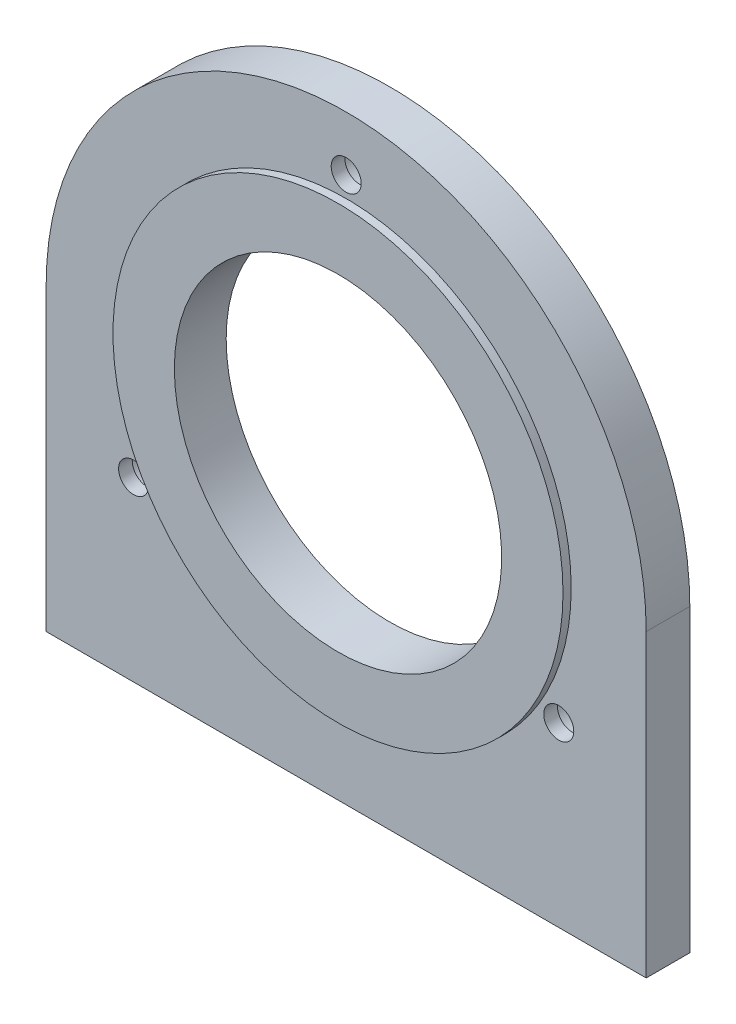
ISO-10303-21;
HEADER;
FILE_DESCRIPTION(('STEP AP214'),'2;1');
FILE_NAME('part.step','',(''),(''),'','','');
FILE_SCHEMA(('AUTOMOTIVE_DESIGN { 1 0 10303 214 1 1 1 1 }'));
ENDSEC;
DATA;
#1=APPLICATION_CONTEXT('core data for automotive mechanical design processes');
#2=APPLICATION_PROTOCOL_DEFINITION('international standard','automotive_design',2000,#1);
#3=PRODUCT_CONTEXT('',#1,'mechanical');
#4=PRODUCT('Part','Part','',(#3));
#5=PRODUCT_RELATED_PRODUCT_CATEGORY('part','',(#4));
#6=PRODUCT_DEFINITION_FORMATION('','',#4);
#7=PRODUCT_DEFINITION_CONTEXT('part definition',#1,'design');
#8=PRODUCT_DEFINITION('design','',#6,#7);
#9=PRODUCT_DEFINITION_SHAPE('','',#8);
#10=(LENGTH_UNIT() NAMED_UNIT(*) SI_UNIT(.MILLI.,.METRE.));
#11=(NAMED_UNIT(*) PLANE_ANGLE_UNIT() SI_UNIT($,.RADIAN.));
#12=(NAMED_UNIT(*) SI_UNIT($,.STERADIAN.) SOLID_ANGLE_UNIT());
#13=UNCERTAINTY_MEASURE_WITH_UNIT(LENGTH_MEASURE(1.E-05),#10,'distance_accuracy_value','');
#14=(GEOMETRIC_REPRESENTATION_CONTEXT(3) GLOBAL_UNCERTAINTY_ASSIGNED_CONTEXT((#13)) GLOBAL_UNIT_ASSIGNED_CONTEXT((#10,
#11,#12)) REPRESENTATION_CONTEXT('',''));
#15=CARTESIAN_POINT('',(0.,0.,0.));
#16=DIRECTION('',(0.,0.,1.));
#17=DIRECTION('',(1.,0.,0.));
#18=AXIS2_PLACEMENT_3D('',#15,#16,#17);
#19=CARTESIAN_POINT('',(0.,0.,16.));
#20=DIRECTION('',(0.,0.,1.));
#21=DIRECTION('',(1.,0.,0.));
#22=AXIS2_PLACEMENT_3D('',#19,#20,#21);
#23=PLANE('',#22);
#24=CARTESIAN_POINT('',(-77.9422863405999,-44.9999999999993,16.));
#25=DIRECTION('',(0.,0.,1.));
#26=DIRECTION('',(1.,0.,0.));
#27=AXIS2_PLACEMENT_3D('',#24,#25,#26);
#28=CIRCLE('',#27,5.49999999999999);
#29=CARTESIAN_POINT('',(-72.4422863405999,-44.9999999999993,16.));
#30=VERTEX_POINT('',#29);
#31=EDGE_CURVE('E41',#30,#30,#28,.T.);
#32=ORIENTED_EDGE('',*,*,#31,.F.);
#33=EDGE_LOOP('',(#32));
#34=FACE_BOUND('',#33,.T.);
#35=CARTESIAN_POINT('',(77.9422863405993,-45.0000000000004,16.));
#36=DIRECTION('',(0.,0.,1.));
#37=DIRECTION('',(1.,0.,0.));
#38=AXIS2_PLACEMENT_3D('',#35,#36,#37);
#39=CIRCLE('',#38,5.49999999999999);
#40=CARTESIAN_POINT('',(83.4422863405993,-45.0000000000004,16.));
#41=VERTEX_POINT('',#40);
#42=EDGE_CURVE('E118',#41,#41,#39,.T.);
#43=ORIENTED_EDGE('',*,*,#42,.F.);
#44=EDGE_LOOP('',(#43));
#45=FACE_BOUND('',#44,.T.);
#46=CARTESIAN_POINT('',(0.,90.,16.));
#47=DIRECTION('',(0.,0.,1.));
#48=DIRECTION('',(1.,0.,0.));
#49=AXIS2_PLACEMENT_3D('',#46,#47,#48);
#50=CIRCLE('',#49,5.5);
#51=CARTESIAN_POINT('',(5.5,90.,16.));
#52=VERTEX_POINT('',#51);
#53=EDGE_CURVE('E115',#52,#52,#50,.T.);
#54=ORIENTED_EDGE('',*,*,#53,.F.);
#55=EDGE_LOOP('',(#54));
#56=FACE_BOUND('',#55,.T.);
#57=CARTESIAN_POINT('',(0.,0.,16.));
#58=DIRECTION('',(0.,0.,1.));
#59=DIRECTION('',(1.,0.,0.));
#60=AXIS2_PLACEMENT_3D('',#57,#58,#59);
#61=CIRCLE('',#60,110.);
#62=CARTESIAN_POINT('',(110.,0.,16.));
#63=VERTEX_POINT('',#62);
#64=CARTESIAN_POINT('',(-110.,0.,16.));
#65=VERTEX_POINT('',#64);
#66=EDGE_CURVE('E11',#63,#65,#61,.T.);
#67=ORIENTED_EDGE('',*,*,#66,.T.);
#68=DIRECTION('',(0.,-1.,0.));
#69=VECTOR('',#68,1.);
#70=CARTESIAN_POINT('',(-110.,0.,16.));
#71=LINE('',#70,#69);
#72=CARTESIAN_POINT('',(-110.,-110.,16.));
#73=VERTEX_POINT('',#72);
#74=EDGE_CURVE('E82',#65,#73,#71,.T.);
#75=ORIENTED_EDGE('',*,*,#74,.T.);
#76=DIRECTION('',(1.,0.,0.));
#77=VECTOR('',#76,1.);
#78=CARTESIAN_POINT('',(-110.,-110.,16.));
#79=LINE('',#78,#77);
#80=CARTESIAN_POINT('',(110.,-110.,16.));
#81=VERTEX_POINT('',#80);
#82=EDGE_CURVE('E90',#73,#81,#79,.T.);
#83=ORIENTED_EDGE('',*,*,#82,.T.);
#84=DIRECTION('',(0.,1.,0.));
#85=VECTOR('',#84,1.);
#86=CARTESIAN_POINT('',(110.,0.,16.));
#87=LINE('',#86,#85);
#88=EDGE_CURVE('E87',#81,#63,#87,.T.);
#89=ORIENTED_EDGE('',*,*,#88,.T.);
#90=EDGE_LOOP('',(#67,#75,#83,#89));
#91=FACE_BOUND('',#90,.T.);
#92=CARTESIAN_POINT('',(0.,0.,16.));
#93=DIRECTION('',(0.,0.,1.));
#94=DIRECTION('',(1.,0.,0.));
#95=AXIS2_PLACEMENT_3D('',#92,#93,#94);
#96=CIRCLE('',#95,82.5);
#97=CARTESIAN_POINT('',(82.5,0.,16.));
#98=VERTEX_POINT('',#97);
#99=EDGE_CURVE('E101',#98,#98,#96,.T.);
#100=ORIENTED_EDGE('',*,*,#99,.F.);
#101=EDGE_LOOP('',(#100));
#102=FACE_BOUND('',#101,.T.);
#103=ADVANCED_FACE('F37',(#34,#45,#56,#91,#102),#23,.T.);
#104=CARTESIAN_POINT('',(0.,0.,16.));
#105=DIRECTION('',(0.,0.,-1.));
#106=DIRECTION('',(-1.,0.,0.));
#107=AXIS2_PLACEMENT_3D('',#104,#105,#106);
#108=CYLINDRICAL_SURFACE('',#107,110.);
#109=CARTESIAN_POINT('',(0.,0.,0.));
#110=DIRECTION('',(0.,0.,1.));
#111=DIRECTION('',(1.,0.,0.));
#112=AXIS2_PLACEMENT_3D('',#109,#110,#111);
#113=CIRCLE('',#112,110.);
#114=CARTESIAN_POINT('',(110.,0.,0.));
#115=VERTEX_POINT('',#114);
#116=CARTESIAN_POINT('',(-110.,0.,0.));
#117=VERTEX_POINT('',#116);
#118=EDGE_CURVE('E46',#115,#117,#113,.T.);
#119=ORIENTED_EDGE('',*,*,#118,.T.);
#120=DIRECTION('',(0.,0.,1.));
#121=VECTOR('',#120,1.);
#122=CARTESIAN_POINT('',(-110.,0.,-245.967477524977));
#123=LINE('',#122,#121);
#124=EDGE_CURVE('E54',#117,#65,#123,.T.);
#125=ORIENTED_EDGE('',*,*,#124,.T.);
#126=ORIENTED_EDGE('',*,*,#66,.F.);
#127=DIRECTION('',(0.,0.,1.));
#128=VECTOR('',#127,1.);
#129=CARTESIAN_POINT('',(110.,0.,-245.967477524977));
#130=LINE('',#129,#128);
#131=EDGE_CURVE('E109',#115,#63,#130,.T.);
#132=ORIENTED_EDGE('',*,*,#131,.F.);
#133=EDGE_LOOP('',(#119,#125,#126,#132));
#134=FACE_BOUND('',#133,.T.);
#135=ADVANCED_FACE('F39',(#134),#108,.T.);
#136=CARTESIAN_POINT('',(0.,0.,0.));
#137=DIRECTION('',(0.,0.,1.));
#138=DIRECTION('',(1.,0.,0.));
#139=AXIS2_PLACEMENT_3D('',#136,#137,#138);
#140=PLANE('',#139);
#141=CARTESIAN_POINT('',(0.,0.,0.));
#142=DIRECTION('',(0.,0.,-1.));
#143=DIRECTION('',(-1.,0.,0.));
#144=AXIS2_PLACEMENT_3D('',#141,#142,#143);
#145=CIRCLE('',#144,60.);
#146=CARTESIAN_POINT('',(-60.,0.,0.));
#147=VERTEX_POINT('',#146);
#148=EDGE_CURVE('E176',#147,#147,#145,.T.);
#149=ORIENTED_EDGE('',*,*,#148,.F.);
#150=EDGE_LOOP('',(#149));
#151=FACE_BOUND('',#150,.T.);
#152=CARTESIAN_POINT('',(-77.9422863405999,-44.9999999999993,0.));
#153=DIRECTION('',(0.,0.,-1.));
#154=DIRECTION('',(-1.,0.,0.));
#155=AXIS2_PLACEMENT_3D('',#152,#153,#154);
#156=CIRCLE('',#155,8.99999999999999);
#157=CARTESIAN_POINT('',(-86.9422863405999,-44.9999999999993,0.));
#158=VERTEX_POINT('',#157);
#159=EDGE_CURVE('E180',#158,#158,#156,.T.);
#160=ORIENTED_EDGE('',*,*,#159,.F.);
#161=EDGE_LOOP('',(#160));
#162=FACE_BOUND('',#161,.T.);
#163=CARTESIAN_POINT('',(77.9422863405993,-45.0000000000004,0.));
#164=DIRECTION('',(0.,0.,-1.));
#165=DIRECTION('',(-1.,0.,0.));
#166=AXIS2_PLACEMENT_3D('',#163,#164,#165);
#167=CIRCLE('',#166,8.99999999999999);
#168=CARTESIAN_POINT('',(68.9422863405993,-45.0000000000004,0.));
#169=VERTEX_POINT('',#168);
#170=EDGE_CURVE('E133',#169,#169,#167,.T.);
#171=ORIENTED_EDGE('',*,*,#170,.F.);
#172=EDGE_LOOP('',(#171));
#173=FACE_BOUND('',#172,.T.);
#174=CARTESIAN_POINT('',(0.,90.,0.));
#175=DIRECTION('',(0.,0.,-1.));
#176=DIRECTION('',(-1.,0.,0.));
#177=AXIS2_PLACEMENT_3D('',#174,#175,#176);
#178=CIRCLE('',#177,9.);
#179=CARTESIAN_POINT('',(-9.,90.,0.));
#180=VERTEX_POINT('',#179);
#181=EDGE_CURVE('E120',#180,#180,#178,.T.);
#182=ORIENTED_EDGE('',*,*,#181,.F.);
#183=EDGE_LOOP('',(#182));
#184=FACE_BOUND('',#183,.T.);
#185=ORIENTED_EDGE('',*,*,#118,.F.);
#186=DIRECTION('',(0.,-1.,0.));
#187=VECTOR('',#186,1.);
#188=CARTESIAN_POINT('',(110.,0.,0.));
#189=LINE('',#188,#187);
#190=CARTESIAN_POINT('',(110.,-110.,0.));
#191=VERTEX_POINT('',#190);
#192=EDGE_CURVE('E108',#115,#191,#189,.T.);
#193=ORIENTED_EDGE('',*,*,#192,.T.);
#194=DIRECTION('',(-1.,0.,0.));
#195=VECTOR('',#194,1.);
#196=CARTESIAN_POINT('',(-110.,-110.,0.));
#197=LINE('',#196,#195);
#198=CARTESIAN_POINT('',(-110.,-110.,0.));
#199=VERTEX_POINT('',#198);
#200=EDGE_CURVE('E112',#191,#199,#197,.T.);
#201=ORIENTED_EDGE('',*,*,#200,.T.);
#202=DIRECTION('',(0.,1.,0.));
#203=VECTOR('',#202,1.);
#204=CARTESIAN_POINT('',(-110.,0.,0.));
#205=LINE('',#204,#203);
#206=EDGE_CURVE('E84',#199,#117,#205,.T.);
#207=ORIENTED_EDGE('',*,*,#206,.T.);
#208=EDGE_LOOP('',(#185,#193,#201,#207));
#209=FACE_BOUND('',#208,.T.);
#210=ADVANCED_FACE('F145',(#151,#162,#173,#184,#209),#140,.F.);
#211=CARTESIAN_POINT('',(-110.,-110.,-245.967477524977));
#212=DIRECTION('',(0.,-1.,0.));
#213=DIRECTION('',(0.,0.,-1.));
#214=AXIS2_PLACEMENT_3D('',#211,#212,#213);
#215=PLANE('',#214);
#216=ORIENTED_EDGE('',*,*,#200,.F.);
#217=DIRECTION('',(0.,0.,1.));
#218=VECTOR('',#217,1.);
#219=CARTESIAN_POINT('',(110.,-110.,-245.967477524977));
#220=LINE('',#219,#218);
#221=EDGE_CURVE('E86',#191,#81,#220,.T.);
#222=ORIENTED_EDGE('',*,*,#221,.T.);
#223=ORIENTED_EDGE('',*,*,#82,.F.);
#224=DIRECTION('',(0.,0.,1.));
#225=VECTOR('',#224,1.);
#226=CARTESIAN_POINT('',(-110.,-110.,-245.967477524977));
#227=LINE('',#226,#225);
#228=EDGE_CURVE('E78',#199,#73,#227,.T.);
#229=ORIENTED_EDGE('',*,*,#228,.F.);
#230=EDGE_LOOP('',(#216,#222,#223,#229));
#231=FACE_BOUND('',#230,.T.);
#232=ADVANCED_FACE('F91',(#231),#215,.T.);
#233=CARTESIAN_POINT('',(-110.,0.,-245.967477524977));
#234=DIRECTION('',(-1.,0.,0.));
#235=DIRECTION('',(0.,-1.,0.));
#236=AXIS2_PLACEMENT_3D('',#233,#234,#235);
#237=PLANE('',#236);
#238=ORIENTED_EDGE('',*,*,#206,.F.);
#239=ORIENTED_EDGE('',*,*,#228,.T.);
#240=ORIENTED_EDGE('',*,*,#74,.F.);
#241=ORIENTED_EDGE('',*,*,#124,.F.);
#242=EDGE_LOOP('',(#238,#239,#240,#241));
#243=FACE_BOUND('',#242,.T.);
#244=ADVANCED_FACE('F80',(#243),#237,.T.);
#245=CARTESIAN_POINT('',(110.,0.,-245.967477524977));
#246=DIRECTION('',(1.,0.,0.));
#247=DIRECTION('',(0.,1.,0.));
#248=AXIS2_PLACEMENT_3D('',#245,#246,#247);
#249=PLANE('',#248);
#250=ORIENTED_EDGE('',*,*,#192,.F.);
#251=ORIENTED_EDGE('',*,*,#131,.T.);
#252=ORIENTED_EDGE('',*,*,#88,.F.);
#253=ORIENTED_EDGE('',*,*,#221,.F.);
#254=EDGE_LOOP('',(#250,#251,#252,#253));
#255=FACE_BOUND('',#254,.T.);
#256=ADVANCED_FACE('F147',(#255),#249,.T.);
#257=CARTESIAN_POINT('',(0.,0.,19.));
#258=DIRECTION('',(0.,0.,-1.));
#259=DIRECTION('',(-1.,0.,0.));
#260=AXIS2_PLACEMENT_3D('',#257,#258,#259);
#261=CYLINDRICAL_SURFACE('',#260,82.5);
#262=CARTESIAN_POINT('',(0.,0.,19.));
#263=DIRECTION('',(0.,0.,1.));
#264=DIRECTION('',(1.,0.,0.));
#265=AXIS2_PLACEMENT_3D('',#262,#263,#264);
#266=CIRCLE('',#265,82.5);
#267=CARTESIAN_POINT('',(82.5,0.,19.));
#268=VERTEX_POINT('',#267);
#269=EDGE_CURVE('E98',#268,#268,#266,.T.);
#270=ORIENTED_EDGE('',*,*,#269,.F.);
#271=EDGE_LOOP('',(#270));
#272=FACE_BOUND('',#271,.T.);
#273=ORIENTED_EDGE('',*,*,#99,.T.);
#274=EDGE_LOOP('',(#273));
#275=FACE_BOUND('',#274,.T.);
#276=ADVANCED_FACE('F149',(#272,#275),#261,.T.);
#277=CARTESIAN_POINT('',(0.,0.,19.));
#278=DIRECTION('',(0.,0.,1.));
#279=DIRECTION('',(1.,0.,0.));
#280=AXIS2_PLACEMENT_3D('',#277,#278,#279);
#281=PLANE('',#280);
#282=CARTESIAN_POINT('',(0.,0.,19.));
#283=DIRECTION('',(0.,0.,-1.));
#284=DIRECTION('',(-1.,0.,0.));
#285=AXIS2_PLACEMENT_3D('',#282,#283,#284);
#286=CIRCLE('',#285,60.);
#287=CARTESIAN_POINT('',(-60.,0.,19.));
#288=VERTEX_POINT('',#287);
#289=EDGE_CURVE('E214',#288,#288,#286,.T.);
#290=ORIENTED_EDGE('',*,*,#289,.T.);
#291=EDGE_LOOP('',(#290));
#292=FACE_BOUND('',#291,.T.);
#293=ORIENTED_EDGE('',*,*,#269,.T.);
#294=EDGE_LOOP('',(#293));
#295=FACE_BOUND('',#294,.T.);
#296=ADVANCED_FACE('F155',(#292,#295),#281,.T.);
#297=CARTESIAN_POINT('',(0.,90.,0.));
#298=DIRECTION('',(0.,0.,-1.));
#299=DIRECTION('',(-1.,0.,0.));
#300=AXIS2_PLACEMENT_3D('',#297,#298,#299);
#301=CYLINDRICAL_SURFACE('',#300,5.5);
#302=ORIENTED_EDGE('',*,*,#53,.T.);
#303=EDGE_LOOP('',(#302));
#304=FACE_BOUND('',#303,.T.);
#305=CARTESIAN_POINT('',(0.,90.,11.));
#306=DIRECTION('',(0.,0.,-1.));
#307=DIRECTION('',(-1.,0.,0.));
#308=AXIS2_PLACEMENT_3D('',#305,#306,#307);
#309=CIRCLE('',#308,5.5);
#310=CARTESIAN_POINT('',(-5.5,90.,11.));
#311=VERTEX_POINT('',#310);
#312=EDGE_CURVE('E117',#311,#311,#309,.T.);
#313=ORIENTED_EDGE('',*,*,#312,.T.);
#314=EDGE_LOOP('',(#313));
#315=FACE_BOUND('',#314,.T.);
#316=ADVANCED_FACE('F198',(#304,#315),#301,.F.);
#317=CARTESIAN_POINT('',(5.5,90.,11.));
#318=DIRECTION('',(0.,0.,1.));
#319=DIRECTION('',(1.,0.,0.));
#320=AXIS2_PLACEMENT_3D('',#317,#318,#319);
#321=PLANE('',#320);
#322=ORIENTED_EDGE('',*,*,#312,.F.);
#323=EDGE_LOOP('',(#322));
#324=FACE_BOUND('',#323,.T.);
#325=CARTESIAN_POINT('',(0.,90.,11.));
#326=DIRECTION('',(0.,0.,-1.));
#327=DIRECTION('',(-1.,0.,0.));
#328=AXIS2_PLACEMENT_3D('',#325,#326,#327);
#329=CIRCLE('',#328,9.);
#330=CARTESIAN_POINT('',(-9.,90.,11.));
#331=VERTEX_POINT('',#330);
#332=EDGE_CURVE('E125',#331,#331,#329,.T.);
#333=ORIENTED_EDGE('',*,*,#332,.T.);
#334=EDGE_LOOP('',(#333));
#335=FACE_BOUND('',#334,.T.);
#336=ADVANCED_FACE('F189',(#324,#335),#321,.F.);
#337=CARTESIAN_POINT('',(0.,90.,0.));
#338=DIRECTION('',(0.,0.,-1.));
#339=DIRECTION('',(-1.,0.,0.));
#340=AXIS2_PLACEMENT_3D('',#337,#338,#339);
#341=CYLINDRICAL_SURFACE('',#340,9.);
#342=ORIENTED_EDGE('',*,*,#332,.F.);
#343=EDGE_LOOP('',(#342));
#344=FACE_BOUND('',#343,.T.);
#345=ORIENTED_EDGE('',*,*,#181,.T.);
#346=EDGE_LOOP('',(#345));
#347=FACE_BOUND('',#346,.T.);
#348=ADVANCED_FACE('F186',(#344,#347),#341,.F.);
#349=CARTESIAN_POINT('',(77.9422863405993,-45.0000000000004,0.));
#350=DIRECTION('',(0.,0.,-1.));
#351=DIRECTION('',(-1.,0.,0.));
#352=AXIS2_PLACEMENT_3D('',#349,#350,#351);
#353=CYLINDRICAL_SURFACE('',#352,5.49999999999999);
#354=ORIENTED_EDGE('',*,*,#42,.T.);
#355=EDGE_LOOP('',(#354));
#356=FACE_BOUND('',#355,.T.);
#357=CARTESIAN_POINT('',(77.9422863405993,-45.0000000000004,11.));
#358=DIRECTION('',(0.,0.,-1.));
#359=DIRECTION('',(-1.,0.,0.));
#360=AXIS2_PLACEMENT_3D('',#357,#358,#359);
#361=CIRCLE('',#360,5.49999999999999);
#362=CARTESIAN_POINT('',(72.4422863405993,-45.0000000000004,11.));
#363=VERTEX_POINT('',#362);
#364=EDGE_CURVE('E121',#363,#363,#361,.T.);
#365=ORIENTED_EDGE('',*,*,#364,.T.);
#366=EDGE_LOOP('',(#365));
#367=FACE_BOUND('',#366,.T.);
#368=ADVANCED_FACE('F188',(#356,#367),#353,.F.);
#369=CARTESIAN_POINT('',(83.4422863405993,-45.0000000000004,11.));
#370=DIRECTION('',(0.,0.,1.));
#371=DIRECTION('',(1.,0.,0.));
#372=AXIS2_PLACEMENT_3D('',#369,#370,#371);
#373=PLANE('',#372);
#374=ORIENTED_EDGE('',*,*,#364,.F.);
#375=EDGE_LOOP('',(#374));
#376=FACE_BOUND('',#375,.T.);
#377=CARTESIAN_POINT('',(77.9422863405993,-45.0000000000004,11.));
#378=DIRECTION('',(0.,0.,-1.));
#379=DIRECTION('',(-1.,0.,0.));
#380=AXIS2_PLACEMENT_3D('',#377,#378,#379);
#381=CIRCLE('',#380,8.99999999999999);
#382=CARTESIAN_POINT('',(68.9422863405993,-45.0000000000004,11.));
#383=VERTEX_POINT('',#382);
#384=EDGE_CURVE('E128',#383,#383,#381,.T.);
#385=ORIENTED_EDGE('',*,*,#384,.T.);
#386=EDGE_LOOP('',(#385));
#387=FACE_BOUND('',#386,.T.);
#388=ADVANCED_FACE('F196',(#376,#387),#373,.F.);
#389=CARTESIAN_POINT('',(77.9422863405993,-45.0000000000004,0.));
#390=DIRECTION('',(0.,0.,-1.));
#391=DIRECTION('',(-1.,0.,0.));
#392=AXIS2_PLACEMENT_3D('',#389,#390,#391);
#393=CYLINDRICAL_SURFACE('',#392,8.99999999999999);
#394=ORIENTED_EDGE('',*,*,#384,.F.);
#395=EDGE_LOOP('',(#394));
#396=FACE_BOUND('',#395,.T.);
#397=ORIENTED_EDGE('',*,*,#170,.T.);
#398=EDGE_LOOP('',(#397));
#399=FACE_BOUND('',#398,.T.);
#400=ADVANCED_FACE('F235',(#396,#399),#393,.F.);
#401=CARTESIAN_POINT('',(-77.9422863405999,-44.9999999999993,0.));
#402=DIRECTION('',(0.,0.,-1.));
#403=DIRECTION('',(-1.,0.,0.));
#404=AXIS2_PLACEMENT_3D('',#401,#402,#403);
#405=CYLINDRICAL_SURFACE('',#404,5.49999999999999);
#406=ORIENTED_EDGE('',*,*,#31,.T.);
#407=EDGE_LOOP('',(#406));
#408=FACE_BOUND('',#407,.T.);
#409=CARTESIAN_POINT('',(-77.9422863405999,-44.9999999999993,11.));
#410=DIRECTION('',(0.,0.,-1.));
#411=DIRECTION('',(-1.,0.,0.));
#412=AXIS2_PLACEMENT_3D('',#409,#410,#411);
#413=CIRCLE('',#412,5.49999999999999);
#414=CARTESIAN_POINT('',(-83.4422863405999,-44.9999999999993,11.));
#415=VERTEX_POINT('',#414);
#416=EDGE_CURVE('E226',#415,#415,#413,.T.);
#417=ORIENTED_EDGE('',*,*,#416,.T.);
#418=EDGE_LOOP('',(#417));
#419=FACE_BOUND('',#418,.T.);
#420=ADVANCED_FACE('F231',(#408,#419),#405,.F.);
#421=CARTESIAN_POINT('',(-72.4422863405999,-44.9999999999993,11.));
#422=DIRECTION('',(0.,0.,1.));
#423=DIRECTION('',(1.,0.,0.));
#424=AXIS2_PLACEMENT_3D('',#421,#422,#423);
#425=PLANE('',#424);
#426=ORIENTED_EDGE('',*,*,#416,.F.);
#427=EDGE_LOOP('',(#426));
#428=FACE_BOUND('',#427,.T.);
#429=CARTESIAN_POINT('',(-77.9422863405999,-44.9999999999993,11.));
#430=DIRECTION('',(0.,0.,-1.));
#431=DIRECTION('',(-1.,0.,0.));
#432=AXIS2_PLACEMENT_3D('',#429,#430,#431);
#433=CIRCLE('',#432,8.99999999999999);
#434=CARTESIAN_POINT('',(-86.9422863405999,-44.9999999999993,11.));
#435=VERTEX_POINT('',#434);
#436=EDGE_CURVE('E220',#435,#435,#433,.T.);
#437=ORIENTED_EDGE('',*,*,#436,.T.);
#438=EDGE_LOOP('',(#437));
#439=FACE_BOUND('',#438,.T.);
#440=ADVANCED_FACE('F234',(#428,#439),#425,.F.);
#441=CARTESIAN_POINT('',(-77.9422863405999,-44.9999999999993,0.));
#442=DIRECTION('',(0.,0.,-1.));
#443=DIRECTION('',(-1.,0.,0.));
#444=AXIS2_PLACEMENT_3D('',#441,#442,#443);
#445=CYLINDRICAL_SURFACE('',#444,8.99999999999999);
#446=ORIENTED_EDGE('',*,*,#436,.F.);
#447=EDGE_LOOP('',(#446));
#448=FACE_BOUND('',#447,.T.);
#449=ORIENTED_EDGE('',*,*,#159,.T.);
#450=EDGE_LOOP('',(#449));
#451=FACE_BOUND('',#450,.T.);
#452=ADVANCED_FACE('F241',(#448,#451),#445,.F.);
#453=CARTESIAN_POINT('',(0.,0.,19.));
#454=DIRECTION('',(0.,0.,-1.));
#455=DIRECTION('',(-1.,0.,0.));
#456=AXIS2_PLACEMENT_3D('',#453,#454,#455);
#457=CYLINDRICAL_SURFACE('',#456,60.);
#458=ORIENTED_EDGE('',*,*,#289,.F.);
#459=EDGE_LOOP('',(#458));
#460=FACE_BOUND('',#459,.T.);
#461=ORIENTED_EDGE('',*,*,#148,.T.);
#462=EDGE_LOOP('',(#461));
#463=FACE_BOUND('',#462,.T.);
#464=ADVANCED_FACE('F247',(#460,#463),#457,.F.);
#465=CLOSED_SHELL('',(#103,#135,#210,#232,#244,#256,#276,#296,#316,#336,#348,#368,#388,#400,
#420,#440,#452,#464));
#466=MANIFOLD_SOLID_BREP('B2',#465);
#467=ADVANCED_BREP_SHAPE_REPRESENTATION('',(#18,#466),#14);
#468=SHAPE_DEFINITION_REPRESENTATION(#9,#467);
ENDSEC;
END-ISO-10303-21;
